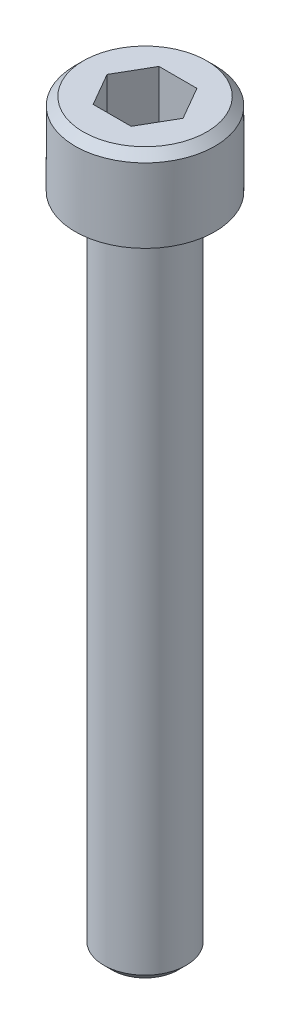
ISO-10303-21;
HEADER;
FILE_DESCRIPTION(('STEP AP214'),'2;1');
FILE_NAME('part.step','',(''),(''),'','','');
FILE_SCHEMA(('AUTOMOTIVE_DESIGN { 1 0 10303 214 1 1 1 1 }'));
ENDSEC;
DATA;
#1=APPLICATION_CONTEXT('core data for automotive mechanical design processes');
#2=APPLICATION_PROTOCOL_DEFINITION('international standard','automotive_design',2000,#1);
#3=PRODUCT_CONTEXT('',#1,'mechanical');
#4=PRODUCT('Part','Part','',(#3));
#5=PRODUCT_RELATED_PRODUCT_CATEGORY('part','',(#4));
#6=PRODUCT_DEFINITION_FORMATION('','',#4);
#7=PRODUCT_DEFINITION_CONTEXT('part definition',#1,'design');
#8=PRODUCT_DEFINITION('design','',#6,#7);
#9=PRODUCT_DEFINITION_SHAPE('','',#8);
#10=(LENGTH_UNIT() NAMED_UNIT(*) SI_UNIT(.MILLI.,.METRE.));
#11=(NAMED_UNIT(*) PLANE_ANGLE_UNIT() SI_UNIT($,.RADIAN.));
#12=(NAMED_UNIT(*) SI_UNIT($,.STERADIAN.) SOLID_ANGLE_UNIT());
#13=UNCERTAINTY_MEASURE_WITH_UNIT(LENGTH_MEASURE(1.E-05),#10,'distance_accuracy_value','');
#14=(GEOMETRIC_REPRESENTATION_CONTEXT(3) GLOBAL_UNCERTAINTY_ASSIGNED_CONTEXT((#13)) GLOBAL_UNIT_ASSIGNED_CONTEXT((#10,
#11,#12)) REPRESENTATION_CONTEXT('',''));
#15=CARTESIAN_POINT('',(0.,0.,0.));
#16=DIRECTION('',(0.,0.,1.));
#17=DIRECTION('',(1.,0.,0.));
#18=AXIS2_PLACEMENT_3D('',#15,#16,#17);
#19=CARTESIAN_POINT('',(4.25,-5.,0.));
#20=DIRECTION('',(0.,-1.,0.));
#21=DIRECTION('',(0.,0.,-1.));
#22=AXIS2_PLACEMENT_3D('',#19,#20,#21);
#23=PLANE('',#22);
#24=CARTESIAN_POINT('',(0.,-5.,0.));
#25=DIRECTION('',(0.,-1.,0.));
#26=DIRECTION('',(0.,0.,-1.));
#27=AXIS2_PLACEMENT_3D('',#24,#25,#26);
#28=CIRCLE('',#27,4.25);
#29=CARTESIAN_POINT('',(0.,-5.,-4.25));
#30=VERTEX_POINT('',#29);
#31=EDGE_CURVE('E177',#30,#30,#28,.T.);
#32=ORIENTED_EDGE('',*,*,#31,.T.);
#33=EDGE_LOOP('',(#32));
#34=FACE_BOUND('',#33,.T.);
#35=CARTESIAN_POINT('',(0.,-5.,0.));
#36=DIRECTION('',(0.,1.,0.));
#37=DIRECTION('',(0.,0.,1.));
#38=AXIS2_PLACEMENT_3D('',#35,#36,#37);
#39=CIRCLE('',#38,4.05);
#40=CARTESIAN_POINT('',(0.,-5.,4.05));
#41=VERTEX_POINT('',#40);
#42=EDGE_CURVE('E173',#41,#41,#39,.T.);
#43=ORIENTED_EDGE('',*,*,#42,.T.);
#44=EDGE_LOOP('',(#43));
#45=FACE_BOUND('',#44,.T.);
#46=ADVANCED_FACE('F45',(#34,#45),#23,.T.);
#47=CARTESIAN_POINT('',(0.,0.,0.));
#48=DIRECTION('',(0.,1.,0.));
#49=DIRECTION('',(0.,0.,1.));
#50=AXIS2_PLACEMENT_3D('',#47,#48,#49);
#51=PLANE('',#50);
#52=DIRECTION('',(-1.,0.,0.));
#53=VECTOR('',#52,1.);
#54=CARTESIAN_POINT('',(1.15470053837925,0.,-2.));
#55=LINE('',#54,#53);
#56=CARTESIAN_POINT('',(1.15470053837925,0.,-2.));
#57=VERTEX_POINT('',#56);
#58=CARTESIAN_POINT('',(-1.15470053837925,0.,-2.));
#59=VERTEX_POINT('',#58);
#60=EDGE_CURVE('E61',#57,#59,#55,.T.);
#61=ORIENTED_EDGE('',*,*,#60,.F.);
#62=DIRECTION('',(-0.5,0.,-0.866025403784439));
#63=VECTOR('',#62,1.);
#64=CARTESIAN_POINT('',(2.3094010767585,0.,0.));
#65=LINE('',#64,#63);
#66=CARTESIAN_POINT('',(2.3094010767585,0.,0.));
#67=VERTEX_POINT('',#66);
#68=EDGE_CURVE('E154',#67,#57,#65,.T.);
#69=ORIENTED_EDGE('',*,*,#68,.F.);
#70=DIRECTION('',(0.5,0.,-0.866025403784439));
#71=VECTOR('',#70,1.);
#72=CARTESIAN_POINT('',(1.15470053837925,0.,2.));
#73=LINE('',#72,#71);
#74=CARTESIAN_POINT('',(1.15470053837925,0.,2.));
#75=VERTEX_POINT('',#74);
#76=EDGE_CURVE('E151',#75,#67,#73,.T.);
#77=ORIENTED_EDGE('',*,*,#76,.F.);
#78=DIRECTION('',(1.,0.,0.));
#79=VECTOR('',#78,1.);
#80=CARTESIAN_POINT('',(-1.15470053837925,0.,2.));
#81=LINE('',#80,#79);
#82=CARTESIAN_POINT('',(-1.15470053837925,0.,2.));
#83=VERTEX_POINT('',#82);
#84=EDGE_CURVE('E109',#83,#75,#81,.T.);
#85=ORIENTED_EDGE('',*,*,#84,.F.);
#86=DIRECTION('',(0.5,0.,0.866025403784438));
#87=VECTOR('',#86,1.);
#88=CARTESIAN_POINT('',(-2.3094010767585,0.,0.));
#89=LINE('',#88,#87);
#90=CARTESIAN_POINT('',(-2.3094010767585,0.,0.));
#91=VERTEX_POINT('',#90);
#92=EDGE_CURVE('E145',#91,#83,#89,.T.);
#93=ORIENTED_EDGE('',*,*,#92,.F.);
#94=DIRECTION('',(-0.5,0.,0.866025403784439));
#95=VECTOR('',#94,1.);
#96=CARTESIAN_POINT('',(-1.15470053837925,0.,-2.));
#97=LINE('',#96,#95);
#98=EDGE_CURVE('E141',#59,#91,#97,.T.);
#99=ORIENTED_EDGE('',*,*,#98,.F.);
#100=EDGE_LOOP('',(#61,#69,#77,#85,#93,#99));
#101=FACE_BOUND('',#100,.T.);
#102=CARTESIAN_POINT('',(0.,0.,0.));
#103=DIRECTION('',(0.,1.,0.));
#104=DIRECTION('',(0.,0.,1.));
#105=AXIS2_PLACEMENT_3D('',#102,#103,#104);
#106=CIRCLE('',#105,3.74999999999999);
#107=CARTESIAN_POINT('',(0.,0.,3.74999999999999));
#108=VERTEX_POINT('',#107);
#109=EDGE_CURVE('E193',#108,#108,#106,.T.);
#110=ORIENTED_EDGE('',*,*,#109,.T.);
#111=EDGE_LOOP('',(#110));
#112=FACE_BOUND('',#111,.T.);
#113=ADVANCED_FACE('F218',(#101,#112),#51,.T.);
#114=CARTESIAN_POINT('',(0.,-45.,0.));
#115=DIRECTION('',(0.,-1.,0.));
#116=DIRECTION('',(0.,0.,-1.));
#117=AXIS2_PLACEMENT_3D('',#114,#115,#116);
#118=CYLINDRICAL_SURFACE('',#117,4.25);
#119=CARTESIAN_POINT('',(0.,-0.500000000000007,0.));
#120=DIRECTION('',(0.,1.,0.));
#121=DIRECTION('',(0.,0.,1.));
#122=AXIS2_PLACEMENT_3D('',#119,#120,#121);
#123=CIRCLE('',#122,4.25);
#124=CARTESIAN_POINT('',(0.,-0.500000000000007,4.25));
#125=VERTEX_POINT('',#124);
#126=EDGE_CURVE('E189',#125,#125,#123,.F.);
#127=ORIENTED_EDGE('',*,*,#126,.T.);
#128=EDGE_LOOP('',(#127));
#129=FACE_BOUND('',#128,.T.);
#130=ORIENTED_EDGE('',*,*,#31,.F.);
#131=EDGE_LOOP('',(#130));
#132=FACE_BOUND('',#131,.T.);
#133=ADVANCED_FACE('F224',(#129,#132),#118,.T.);
#134=CARTESIAN_POINT('',(0.,-0.500000000000007,0.));
#135=DIRECTION('',(0.,-1.,0.));
#136=DIRECTION('',(0.,0.,-1.));
#137=AXIS2_PLACEMENT_3D('',#134,#135,#136);
#138=CONICAL_SURFACE('',#137,4.25,0.785398163397455);
#139=ORIENTED_EDGE('',*,*,#109,.F.);
#140=EDGE_LOOP('',(#139));
#141=FACE_BOUND('',#140,.T.);
#142=ORIENTED_EDGE('',*,*,#126,.F.);
#143=EDGE_LOOP('',(#142));
#144=FACE_BOUND('',#143,.T.);
#145=ADVANCED_FACE('F231',(#141,#144),#138,.T.);
#146=CARTESIAN_POINT('',(0.,-5.,0.));
#147=DIRECTION('',(0.,-1.,0.));
#148=DIRECTION('',(0.,0.,-1.));
#149=AXIS2_PLACEMENT_3D('',#146,#147,#148);
#150=CONICAL_SURFACE('',#149,4.05,0.785398163397448);
#151=CARTESIAN_POINT('',(0.,-4.9,0.));
#152=DIRECTION('',(0.,1.,0.));
#153=DIRECTION('',(0.,0.,1.));
#154=AXIS2_PLACEMENT_3D('',#151,#152,#153);
#155=CIRCLE('',#154,3.95);
#156=CARTESIAN_POINT('',(0.,-4.9,3.95));
#157=VERTEX_POINT('',#156);
#158=EDGE_CURVE('E160',#157,#157,#155,.T.);
#159=ORIENTED_EDGE('',*,*,#158,.T.);
#160=EDGE_LOOP('',(#159));
#161=FACE_BOUND('',#160,.T.);
#162=ORIENTED_EDGE('',*,*,#42,.F.);
#163=EDGE_LOOP('',(#162));
#164=FACE_BOUND('',#163,.T.);
#165=ADVANCED_FACE('F244',(#161,#164),#150,.F.);
#166=CARTESIAN_POINT('',(3.95,-4.9,0.));
#167=DIRECTION('',(0.,-1.,0.));
#168=DIRECTION('',(0.,0.,-1.));
#169=AXIS2_PLACEMENT_3D('',#166,#167,#168);
#170=PLANE('',#169);
#171=CARTESIAN_POINT('',(0.,-4.9,0.));
#172=DIRECTION('',(0.,-1.,0.));
#173=DIRECTION('',(0.,0.,-1.));
#174=AXIS2_PLACEMENT_3D('',#171,#172,#173);
#175=CIRCLE('',#174,3.5);
#176=CARTESIAN_POINT('',(0.,-4.9,-3.5));
#177=VERTEX_POINT('',#176);
#178=EDGE_CURVE('E54',#177,#177,#175,.F.);
#179=ORIENTED_EDGE('',*,*,#178,.T.);
#180=EDGE_LOOP('',(#179));
#181=FACE_BOUND('',#180,.T.);
#182=ORIENTED_EDGE('',*,*,#158,.F.);
#183=EDGE_LOOP('',(#182));
#184=FACE_BOUND('',#183,.T.);
#185=ADVANCED_FACE('F200',(#181,#184),#170,.T.);
#186=CARTESIAN_POINT('',(2.5,-45.,0.));
#187=DIRECTION('',(0.,-1.,0.));
#188=DIRECTION('',(0.,0.,-1.));
#189=AXIS2_PLACEMENT_3D('',#186,#187,#188);
#190=PLANE('',#189);
#191=CARTESIAN_POINT('',(0.,-45.,0.));
#192=DIRECTION('',(0.,-1.,0.));
#193=DIRECTION('',(0.,0.,-1.));
#194=AXIS2_PLACEMENT_3D('',#191,#192,#193);
#195=CIRCLE('',#194,2.);
#196=CARTESIAN_POINT('',(0.,-45.,-2.));
#197=VERTEX_POINT('',#196);
#198=EDGE_CURVE('E181',#197,#197,#195,.T.);
#199=ORIENTED_EDGE('',*,*,#198,.T.);
#200=EDGE_LOOP('',(#199));
#201=FACE_BOUND('',#200,.T.);
#202=ADVANCED_FACE('F239',(#201),#190,.T.);
#203=CARTESIAN_POINT('',(0.,-45.,0.));
#204=DIRECTION('',(0.,1.,0.));
#205=DIRECTION('',(0.,0.,1.));
#206=AXIS2_PLACEMENT_3D('',#203,#204,#205);
#207=CONICAL_SURFACE('',#206,2.,0.785398163397448);
#208=CARTESIAN_POINT('',(0.,-44.5,0.));
#209=DIRECTION('',(0.,-1.,0.));
#210=DIRECTION('',(0.,0.,-1.));
#211=AXIS2_PLACEMENT_3D('',#208,#209,#210);
#212=CIRCLE('',#211,2.5);
#213=CARTESIAN_POINT('',(0.,-44.5,-2.5));
#214=VERTEX_POINT('',#213);
#215=EDGE_CURVE('E185',#214,#214,#212,.F.);
#216=ORIENTED_EDGE('',*,*,#215,.F.);
#217=EDGE_LOOP('',(#216));
#218=FACE_BOUND('',#217,.T.);
#219=ORIENTED_EDGE('',*,*,#198,.F.);
#220=EDGE_LOOP('',(#219));
#221=FACE_BOUND('',#220,.T.);
#222=ADVANCED_FACE('F213',(#218,#221),#207,.T.);
#223=CARTESIAN_POINT('',(0.,-45.,0.));
#224=DIRECTION('',(0.,-1.,0.));
#225=DIRECTION('',(0.,0.,-1.));
#226=AXIS2_PLACEMENT_3D('',#223,#224,#225);
#227=CYLINDRICAL_SURFACE('',#226,2.5);
#228=CARTESIAN_POINT('',(0.,-5.9,0.));
#229=DIRECTION('',(0.,-1.,0.));
#230=DIRECTION('',(0.,0.,-1.));
#231=AXIS2_PLACEMENT_3D('',#228,#229,#230);
#232=CIRCLE('',#231,2.5);
#233=CARTESIAN_POINT('',(0.,-5.9,-2.5));
#234=VERTEX_POINT('',#233);
#235=EDGE_CURVE('E11',#234,#234,#232,.T.);
#236=ORIENTED_EDGE('',*,*,#235,.T.);
#237=EDGE_LOOP('',(#236));
#238=FACE_BOUND('',#237,.T.);
#239=ORIENTED_EDGE('',*,*,#215,.T.);
#240=EDGE_LOOP('',(#239));
#241=FACE_BOUND('',#240,.T.);
#242=ADVANCED_FACE('F205',(#238,#241),#227,.T.);
#243=CARTESIAN_POINT('',(0.,-5.9,0.));
#244=DIRECTION('',(0.,-1.,0.));
#245=DIRECTION('',(0.,0.,-1.));
#246=AXIS2_PLACEMENT_3D('',#243,#244,#245);
#247=TOROIDAL_SURFACE('',#246,3.5,1.);
#248=ORIENTED_EDGE('',*,*,#235,.F.);
#249=EDGE_LOOP('',(#248));
#250=FACE_BOUND('',#249,.T.);
#251=ORIENTED_EDGE('',*,*,#178,.F.);
#252=EDGE_LOOP('',(#251));
#253=FACE_BOUND('',#252,.T.);
#254=ADVANCED_FACE('F47',(#250,#253),#247,.F.);
#255=CARTESIAN_POINT('',(1.15470053837925,-4.,-2.));
#256=DIRECTION('',(0.,0.,-1.));
#257=DIRECTION('',(-1.,0.,0.));
#258=AXIS2_PLACEMENT_3D('',#255,#256,#257);
#259=PLANE('',#258);
#260=ORIENTED_EDGE('',*,*,#60,.T.);
#261=DIRECTION('',(0.,1.,0.));
#262=VECTOR('',#261,1.);
#263=CARTESIAN_POINT('',(-1.15470053837925,-4.,-2.));
#264=LINE('',#263,#262);
#265=CARTESIAN_POINT('',(-1.15470053837925,-4.,-2.));
#266=VERTEX_POINT('',#265);
#267=EDGE_CURVE('E91',#266,#59,#264,.T.);
#268=ORIENTED_EDGE('',*,*,#267,.F.);
#269=DIRECTION('',(-1.,0.,0.));
#270=VECTOR('',#269,1.);
#271=CARTESIAN_POINT('',(1.15470053837925,-4.,-2.));
#272=LINE('',#271,#270);
#273=CARTESIAN_POINT('',(1.15470053837925,-4.,-2.));
#274=VERTEX_POINT('',#273);
#275=EDGE_CURVE('E157',#274,#266,#272,.T.);
#276=ORIENTED_EDGE('',*,*,#275,.F.);
#277=DIRECTION('',(0.,1.,0.));
#278=VECTOR('',#277,1.);
#279=CARTESIAN_POINT('',(1.15470053837925,-4.,-2.));
#280=LINE('',#279,#278);
#281=EDGE_CURVE('E69',#274,#57,#280,.T.);
#282=ORIENTED_EDGE('',*,*,#281,.T.);
#283=EDGE_LOOP('',(#260,#268,#276,#282));
#284=FACE_BOUND('',#283,.T.);
#285=ADVANCED_FACE('F204',(#284),#259,.F.);
#286=CARTESIAN_POINT('',(2.3094010767585,-4.,0.));
#287=DIRECTION('',(0.866025403784439,0.,-0.5));
#288=DIRECTION('',(-0.5,0.,-0.866025403784439));
#289=AXIS2_PLACEMENT_3D('',#286,#287,#288);
#290=PLANE('',#289);
#291=ORIENTED_EDGE('',*,*,#68,.T.);
#292=ORIENTED_EDGE('',*,*,#281,.F.);
#293=DIRECTION('',(-0.5,0.,-0.866025403784439));
#294=VECTOR('',#293,1.);
#295=CARTESIAN_POINT('',(2.3094010767585,-4.,0.));
#296=LINE('',#295,#294);
#297=CARTESIAN_POINT('',(2.3094010767585,-4.,0.));
#298=VERTEX_POINT('',#297);
#299=EDGE_CURVE('E123',#298,#274,#296,.T.);
#300=ORIENTED_EDGE('',*,*,#299,.F.);
#301=DIRECTION('',(0.,1.,0.));
#302=VECTOR('',#301,1.);
#303=CARTESIAN_POINT('',(2.3094010767585,-4.,0.));
#304=LINE('',#303,#302);
#305=EDGE_CURVE('E114',#298,#67,#304,.T.);
#306=ORIENTED_EDGE('',*,*,#305,.T.);
#307=EDGE_LOOP('',(#291,#292,#300,#306));
#308=FACE_BOUND('',#307,.T.);
#309=ADVANCED_FACE('F211',(#308),#290,.F.);
#310=CARTESIAN_POINT('',(1.15470053837925,-4.,2.));
#311=DIRECTION('',(0.866025403784439,0.,0.5));
#312=DIRECTION('',(0.5,0.,-0.866025403784439));
#313=AXIS2_PLACEMENT_3D('',#310,#311,#312);
#314=PLANE('',#313);
#315=ORIENTED_EDGE('',*,*,#76,.T.);
#316=ORIENTED_EDGE('',*,*,#305,.F.);
#317=DIRECTION('',(0.5,0.,-0.866025403784439));
#318=VECTOR('',#317,1.);
#319=CARTESIAN_POINT('',(1.15470053837925,-4.,2.));
#320=LINE('',#319,#318);
#321=CARTESIAN_POINT('',(1.15470053837925,-4.,2.));
#322=VERTEX_POINT('',#321);
#323=EDGE_CURVE('E118',#322,#298,#320,.T.);
#324=ORIENTED_EDGE('',*,*,#323,.F.);
#325=DIRECTION('',(0.,1.,0.));
#326=VECTOR('',#325,1.);
#327=CARTESIAN_POINT('',(1.15470053837925,-4.,2.));
#328=LINE('',#327,#326);
#329=EDGE_CURVE('E102',#322,#75,#328,.T.);
#330=ORIENTED_EDGE('',*,*,#329,.T.);
#331=EDGE_LOOP('',(#315,#316,#324,#330));
#332=FACE_BOUND('',#331,.T.);
#333=ADVANCED_FACE('F119',(#332),#314,.F.);
#334=CARTESIAN_POINT('',(-1.15470053837925,-4.,2.));
#335=DIRECTION('',(0.,0.,1.));
#336=DIRECTION('',(1.,0.,0.));
#337=AXIS2_PLACEMENT_3D('',#334,#335,#336);
#338=PLANE('',#337);
#339=ORIENTED_EDGE('',*,*,#84,.T.);
#340=ORIENTED_EDGE('',*,*,#329,.F.);
#341=DIRECTION('',(1.,0.,0.));
#342=VECTOR('',#341,1.);
#343=CARTESIAN_POINT('',(-1.15470053837925,-4.,2.));
#344=LINE('',#343,#342);
#345=CARTESIAN_POINT('',(-1.15470053837925,-4.,2.));
#346=VERTEX_POINT('',#345);
#347=EDGE_CURVE('E106',#346,#322,#344,.T.);
#348=ORIENTED_EDGE('',*,*,#347,.F.);
#349=DIRECTION('',(0.,1.,0.));
#350=VECTOR('',#349,1.);
#351=CARTESIAN_POINT('',(-1.15470053837925,-4.,2.));
#352=LINE('',#351,#350);
#353=EDGE_CURVE('E115',#346,#83,#352,.T.);
#354=ORIENTED_EDGE('',*,*,#353,.T.);
#355=EDGE_LOOP('',(#339,#340,#348,#354));
#356=FACE_BOUND('',#355,.T.);
#357=ADVANCED_FACE('F104',(#356),#338,.F.);
#358=CARTESIAN_POINT('',(-2.3094010767585,-4.,0.));
#359=DIRECTION('',(-0.866025403784439,0.,0.5));
#360=DIRECTION('',(0.5,0.,0.866025403784438));
#361=AXIS2_PLACEMENT_3D('',#358,#359,#360);
#362=PLANE('',#361);
#363=ORIENTED_EDGE('',*,*,#92,.T.);
#364=ORIENTED_EDGE('',*,*,#353,.F.);
#365=DIRECTION('',(0.5,0.,0.866025403784438));
#366=VECTOR('',#365,1.);
#367=CARTESIAN_POINT('',(-2.3094010767585,-4.,0.));
#368=LINE('',#367,#366);
#369=CARTESIAN_POINT('',(-2.3094010767585,-4.,0.));
#370=VERTEX_POINT('',#369);
#371=EDGE_CURVE('E129',#370,#346,#368,.T.);
#372=ORIENTED_EDGE('',*,*,#371,.F.);
#373=DIRECTION('',(0.,1.,0.));
#374=VECTOR('',#373,1.);
#375=CARTESIAN_POINT('',(-2.3094010767585,-4.,0.));
#376=LINE('',#375,#374);
#377=EDGE_CURVE('E165',#370,#91,#376,.T.);
#378=ORIENTED_EDGE('',*,*,#377,.T.);
#379=EDGE_LOOP('',(#363,#364,#372,#378));
#380=FACE_BOUND('',#379,.T.);
#381=ADVANCED_FACE('F329',(#380),#362,.F.);
#382=CARTESIAN_POINT('',(-1.15470053837925,-4.,-2.));
#383=DIRECTION('',(-0.866025403784439,0.,-0.5));
#384=DIRECTION('',(-0.5,0.,0.866025403784439));
#385=AXIS2_PLACEMENT_3D('',#382,#383,#384);
#386=PLANE('',#385);
#387=ORIENTED_EDGE('',*,*,#98,.T.);
#388=ORIENTED_EDGE('',*,*,#377,.F.);
#389=DIRECTION('',(-0.5,0.,0.866025403784439));
#390=VECTOR('',#389,1.);
#391=CARTESIAN_POINT('',(-1.15470053837925,-4.,-2.));
#392=LINE('',#391,#390);
#393=EDGE_CURVE('E133',#266,#370,#392,.T.);
#394=ORIENTED_EDGE('',*,*,#393,.F.);
#395=ORIENTED_EDGE('',*,*,#267,.T.);
#396=EDGE_LOOP('',(#387,#388,#394,#395));
#397=FACE_BOUND('',#396,.T.);
#398=ADVANCED_FACE('F339',(#397),#386,.F.);
#399=CARTESIAN_POINT('',(0.,-4.,0.));
#400=DIRECTION('',(0.,1.,0.));
#401=DIRECTION('',(0.,0.,1.));
#402=AXIS2_PLACEMENT_3D('',#399,#400,#401);
#403=PLANE('',#402);
#404=ORIENTED_EDGE('',*,*,#275,.T.);
#405=ORIENTED_EDGE('',*,*,#393,.T.);
#406=ORIENTED_EDGE('',*,*,#371,.T.);
#407=ORIENTED_EDGE('',*,*,#347,.T.);
#408=ORIENTED_EDGE('',*,*,#323,.T.);
#409=ORIENTED_EDGE('',*,*,#299,.T.);
#410=EDGE_LOOP('',(#404,#405,#406,#407,#408,#409));
#411=FACE_BOUND('',#410,.T.);
#412=ADVANCED_FACE('F126',(#411),#403,.T.);
#413=CLOSED_SHELL('',(#46,#113,#133,#145,#165,#185,#202,#222,#242,#254,#285,#309,#333,#357,#381,
#398,#412));
#414=MANIFOLD_SOLID_BREP('B2',#413);
#415=ADVANCED_BREP_SHAPE_REPRESENTATION('',(#18,#414),#14);
#416=SHAPE_DEFINITION_REPRESENTATION(#9,#415);
ENDSEC;
END-ISO-10303-21;
